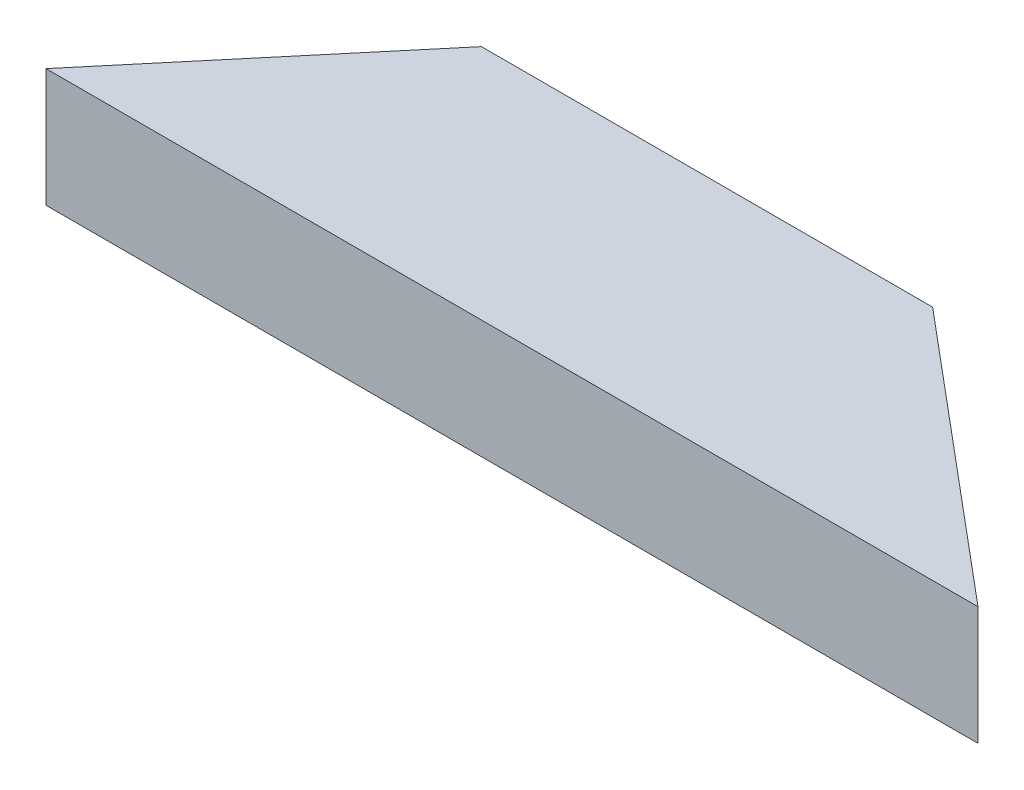
ISO-10303-21;
HEADER;
FILE_DESCRIPTION(('STEP AP214'),'2;1');
FILE_NAME('part.step','',(''),(''),'','','');
FILE_SCHEMA(('AUTOMOTIVE_DESIGN { 1 0 10303 214 1 1 1 1 }'));
ENDSEC;
DATA;
#1=APPLICATION_CONTEXT('core data for automotive mechanical design processes');
#2=APPLICATION_PROTOCOL_DEFINITION('international standard','automotive_design',2000,#1);
#3=PRODUCT_CONTEXT('',#1,'mechanical');
#4=PRODUCT('Part','Part','',(#3));
#5=PRODUCT_RELATED_PRODUCT_CATEGORY('part','',(#4));
#6=PRODUCT_DEFINITION_FORMATION('','',#4);
#7=PRODUCT_DEFINITION_CONTEXT('part definition',#1,'design');
#8=PRODUCT_DEFINITION('design','',#6,#7);
#9=PRODUCT_DEFINITION_SHAPE('','',#8);
#10=(LENGTH_UNIT() NAMED_UNIT(*) SI_UNIT(.MILLI.,.METRE.));
#11=(NAMED_UNIT(*) PLANE_ANGLE_UNIT() SI_UNIT($,.RADIAN.));
#12=(NAMED_UNIT(*) SI_UNIT($,.STERADIAN.) SOLID_ANGLE_UNIT());
#13=UNCERTAINTY_MEASURE_WITH_UNIT(LENGTH_MEASURE(1.E-05),#10,'distance_accuracy_value','');
#14=(GEOMETRIC_REPRESENTATION_CONTEXT(3) GLOBAL_UNCERTAINTY_ASSIGNED_CONTEXT((#13)) GLOBAL_UNIT_ASSIGNED_CONTEXT((#10,
#11,#12)) REPRESENTATION_CONTEXT('',''));
#15=CARTESIAN_POINT('',(0.,0.,0.));
#16=DIRECTION('',(0.,0.,1.));
#17=DIRECTION('',(1.,0.,0.));
#18=AXIS2_PLACEMENT_3D('',#15,#16,#17);
#19=CARTESIAN_POINT('',(85.2631741433041,50.8,-101.6));
#20=DIRECTION('',(0.766004898198113,0.,0.642834734544189));
#21=DIRECTION('',(0.642834734544189,0.,-0.766004898198113));
#22=AXIS2_PLACEMENT_3D('',#19,#20,#21);
#23=PLANE('',#22);
#24=DIRECTION('',(-0.642834734544189,0.,0.766004898198113));
#25=VECTOR('',#24,1.);
#26=CARTESIAN_POINT('',(85.2631741433041,0.,-101.6));
#27=LINE('',#26,#25);
#28=CARTESIAN_POINT('',(85.2631741433041,0.,-101.6));
#29=VERTEX_POINT('',#28);
#30=CARTESIAN_POINT('',(0.,0.,0.));
#31=VERTEX_POINT('',#30);
#32=EDGE_CURVE('E98',#29,#31,#27,.T.);
#33=ORIENTED_EDGE('',*,*,#32,.T.);
#34=DIRECTION('',(0.,-1.,0.));
#35=VECTOR('',#34,1.);
#36=CARTESIAN_POINT('',(0.,50.8,0.));
#37=LINE('',#36,#35);
#38=CARTESIAN_POINT('',(0.,50.8,0.));
#39=VERTEX_POINT('',#38);
#40=EDGE_CURVE('E11',#39,#31,#37,.T.);
#41=ORIENTED_EDGE('',*,*,#40,.F.);
#42=DIRECTION('',(-0.642834734544189,0.,0.766004898198113));
#43=VECTOR('',#42,1.);
#44=CARTESIAN_POINT('',(85.2631741433041,50.8,-101.6));
#45=LINE('',#44,#43);
#46=CARTESIAN_POINT('',(85.2631741433041,50.8,-101.6));
#47=VERTEX_POINT('',#46);
#48=EDGE_CURVE('E86',#47,#39,#45,.T.);
#49=ORIENTED_EDGE('',*,*,#48,.F.);
#50=DIRECTION('',(0.,-1.,0.));
#51=VECTOR('',#50,1.);
#52=CARTESIAN_POINT('',(85.2631741433041,50.8,-101.6));
#53=LINE('',#52,#51);
#54=EDGE_CURVE('E94',#47,#29,#53,.T.);
#55=ORIENTED_EDGE('',*,*,#54,.T.);
#56=EDGE_LOOP('',(#33,#41,#49,#55));
#57=FACE_BOUND('',#56,.T.);
#58=ADVANCED_FACE('F35',(#57),#23,.F.);
#59=CARTESIAN_POINT('',(0.,50.8,0.));
#60=DIRECTION('',(0.,0.,-1.));
#61=DIRECTION('',(-1.,0.,0.));
#62=AXIS2_PLACEMENT_3D('',#59,#60,#61);
#63=PLANE('',#62);
#64=DIRECTION('',(1.,0.,0.));
#65=VECTOR('',#64,1.);
#66=CARTESIAN_POINT('',(0.,0.,0.));
#67=LINE('',#66,#65);
#68=CARTESIAN_POINT('',(400.,0.,0.));
#69=VERTEX_POINT('',#68);
#70=EDGE_CURVE('E90',#31,#69,#67,.T.);
#71=ORIENTED_EDGE('',*,*,#70,.T.);
#72=DIRECTION('',(0.,-1.,0.));
#73=VECTOR('',#72,1.);
#74=CARTESIAN_POINT('',(400.,50.8,0.));
#75=LINE('',#74,#73);
#76=CARTESIAN_POINT('',(400.,50.8,0.));
#77=VERTEX_POINT('',#76);
#78=EDGE_CURVE('E43',#77,#69,#75,.T.);
#79=ORIENTED_EDGE('',*,*,#78,.F.);
#80=DIRECTION('',(1.,0.,0.));
#81=VECTOR('',#80,1.);
#82=CARTESIAN_POINT('',(0.,50.8,0.));
#83=LINE('',#82,#81);
#84=EDGE_CURVE('E81',#39,#77,#83,.T.);
#85=ORIENTED_EDGE('',*,*,#84,.F.);
#86=ORIENTED_EDGE('',*,*,#40,.T.);
#87=EDGE_LOOP('',(#71,#79,#85,#86));
#88=FACE_BOUND('',#87,.T.);
#89=ADVANCED_FACE('F89',(#88),#63,.F.);
#90=CARTESIAN_POINT('',(400.,50.8,0.));
#91=DIRECTION('',(-0.64283473454419,0.,0.766004898198113));
#92=DIRECTION('',(0.766004898198113,0.,0.64283473454419));
#93=AXIS2_PLACEMENT_3D('',#90,#91,#92);
#94=PLANE('',#93);
#95=DIRECTION('',(-0.766004898198113,0.,-0.64283473454419));
#96=VECTOR('',#95,1.);
#97=CARTESIAN_POINT('',(400.,0.,0.));
#98=LINE('',#97,#96);
#99=CARTESIAN_POINT('',(278.932961343304,0.,-101.6));
#100=VERTEX_POINT('',#99);
#101=EDGE_CURVE('E68',#69,#100,#98,.T.);
#102=ORIENTED_EDGE('',*,*,#101,.T.);
#103=DIRECTION('',(0.,-1.,0.));
#104=VECTOR('',#103,1.);
#105=CARTESIAN_POINT('',(278.932961343304,50.8,-101.6));
#106=LINE('',#105,#104);
#107=CARTESIAN_POINT('',(278.932961343304,50.8,-101.6));
#108=VERTEX_POINT('',#107);
#109=EDGE_CURVE('E91',#108,#100,#106,.T.);
#110=ORIENTED_EDGE('',*,*,#109,.F.);
#111=DIRECTION('',(-0.766004898198113,0.,-0.64283473454419));
#112=VECTOR('',#111,1.);
#113=CARTESIAN_POINT('',(400.,50.8,0.));
#114=LINE('',#113,#112);
#115=EDGE_CURVE('E84',#77,#108,#114,.T.);
#116=ORIENTED_EDGE('',*,*,#115,.F.);
#117=ORIENTED_EDGE('',*,*,#78,.T.);
#118=EDGE_LOOP('',(#102,#110,#116,#117));
#119=FACE_BOUND('',#118,.T.);
#120=ADVANCED_FACE('F92',(#119),#94,.F.);
#121=CARTESIAN_POINT('',(278.932961343304,50.8,-101.6));
#122=DIRECTION('',(0.,0.,1.));
#123=DIRECTION('',(1.,0.,0.));
#124=AXIS2_PLACEMENT_3D('',#121,#122,#123);
#125=PLANE('',#124);
#126=DIRECTION('',(-1.,0.,0.));
#127=VECTOR('',#126,1.);
#128=CARTESIAN_POINT('',(278.932961343304,0.,-101.6));
#129=LINE('',#128,#127);
#130=EDGE_CURVE('E74',#100,#29,#129,.T.);
#131=ORIENTED_EDGE('',*,*,#130,.T.);
#132=ORIENTED_EDGE('',*,*,#54,.F.);
#133=DIRECTION('',(-1.,0.,0.));
#134=VECTOR('',#133,1.);
#135=CARTESIAN_POINT('',(278.932961343304,50.8,-101.6));
#136=LINE('',#135,#134);
#137=EDGE_CURVE('E51',#108,#47,#136,.T.);
#138=ORIENTED_EDGE('',*,*,#137,.F.);
#139=ORIENTED_EDGE('',*,*,#109,.T.);
#140=EDGE_LOOP('',(#131,#132,#138,#139));
#141=FACE_BOUND('',#140,.T.);
#142=ADVANCED_FACE('F105',(#141),#125,.F.);
#143=CARTESIAN_POINT('',(0.,50.8,0.));
#144=DIRECTION('',(0.,-1.,0.));
#145=DIRECTION('',(0.,0.,-1.));
#146=AXIS2_PLACEMENT_3D('',#143,#144,#145);
#147=PLANE('',#146);
#148=ORIENTED_EDGE('',*,*,#48,.T.);
#149=ORIENTED_EDGE('',*,*,#84,.T.);
#150=ORIENTED_EDGE('',*,*,#115,.T.);
#151=ORIENTED_EDGE('',*,*,#137,.T.);
#152=EDGE_LOOP('',(#148,#149,#150,#151));
#153=FACE_BOUND('',#152,.T.);
#154=ADVANCED_FACE('F82',(#153),#147,.F.);
#155=CARTESIAN_POINT('',(0.,0.,0.));
#156=DIRECTION('',(0.,-1.,0.));
#157=DIRECTION('',(0.,0.,-1.));
#158=AXIS2_PLACEMENT_3D('',#155,#156,#157);
#159=PLANE('',#158);
#160=ORIENTED_EDGE('',*,*,#32,.F.);
#161=ORIENTED_EDGE('',*,*,#130,.F.);
#162=ORIENTED_EDGE('',*,*,#101,.F.);
#163=ORIENTED_EDGE('',*,*,#70,.F.);
#164=EDGE_LOOP('',(#160,#161,#162,#163));
#165=FACE_BOUND('',#164,.T.);
#166=ADVANCED_FACE('F108',(#165),#159,.T.);
#167=CLOSED_SHELL('',(#58,#89,#120,#142,#154,#166));
#168=MANIFOLD_SOLID_BREP('B2',#167);
#169=ADVANCED_BREP_SHAPE_REPRESENTATION('',(#18,#168),#14);
#170=SHAPE_DEFINITION_REPRESENTATION(#9,#169);
ENDSEC;
END-ISO-10303-21;
